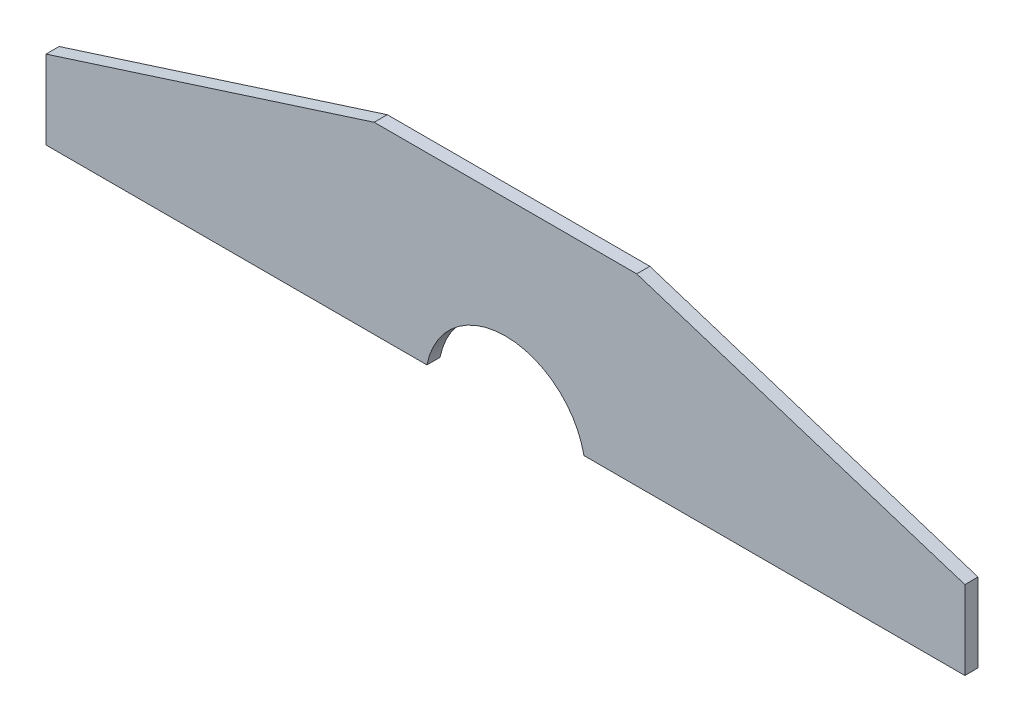
ISO-10303-21;
HEADER;
FILE_DESCRIPTION(('STEP AP214'),'2;1');
FILE_NAME('part.step','',(''),(''),'','','');
FILE_SCHEMA(('AUTOMOTIVE_DESIGN { 1 0 10303 214 1 1 1 1 }'));
ENDSEC;
DATA;
#1=APPLICATION_CONTEXT('core data for automotive mechanical design processes');
#2=APPLICATION_PROTOCOL_DEFINITION('international standard','automotive_design',2000,#1);
#3=PRODUCT_CONTEXT('',#1,'mechanical');
#4=PRODUCT('Part','Part','',(#3));
#5=PRODUCT_RELATED_PRODUCT_CATEGORY('part','',(#4));
#6=PRODUCT_DEFINITION_FORMATION('','',#4);
#7=PRODUCT_DEFINITION_CONTEXT('part definition',#1,'design');
#8=PRODUCT_DEFINITION('design','',#6,#7);
#9=PRODUCT_DEFINITION_SHAPE('','',#8);
#10=(LENGTH_UNIT() NAMED_UNIT(*) SI_UNIT(.MILLI.,.METRE.));
#11=(NAMED_UNIT(*) PLANE_ANGLE_UNIT() SI_UNIT($,.RADIAN.));
#12=(NAMED_UNIT(*) SI_UNIT($,.STERADIAN.) SOLID_ANGLE_UNIT());
#13=UNCERTAINTY_MEASURE_WITH_UNIT(LENGTH_MEASURE(1.E-05),#10,'distance_accuracy_value','');
#14=(GEOMETRIC_REPRESENTATION_CONTEXT(3) GLOBAL_UNCERTAINTY_ASSIGNED_CONTEXT((#13)) GLOBAL_UNIT_ASSIGNED_CONTEXT((#10,
#11,#12)) REPRESENTATION_CONTEXT('',''));
#15=CARTESIAN_POINT('',(0.,0.,0.));
#16=DIRECTION('',(0.,0.,1.));
#17=DIRECTION('',(1.,0.,0.));
#18=AXIS2_PLACEMENT_3D('',#15,#16,#17);
#19=CARTESIAN_POINT('',(-175.,6.,5.));
#20=DIRECTION('',(1.,0.,0.));
#21=DIRECTION('',(0.,0.,-1.));
#22=AXIS2_PLACEMENT_3D('',#19,#20,#21);
#23=PLANE('',#22);
#24=DIRECTION('',(0.,-1.,0.));
#25=VECTOR('',#24,1.);
#26=CARTESIAN_POINT('',(-175.,6.,0.));
#27=LINE('',#26,#25);
#28=CARTESIAN_POINT('',(-175.,36.,0.));
#29=VERTEX_POINT('',#28);
#30=CARTESIAN_POINT('',(-175.,6.,0.));
#31=VERTEX_POINT('',#30);
#32=EDGE_CURVE('E142',#29,#31,#27,.T.);
#33=ORIENTED_EDGE('',*,*,#32,.T.);
#34=DIRECTION('',(0.,0.,-1.));
#35=VECTOR('',#34,1.);
#36=CARTESIAN_POINT('',(-175.,6.,5.));
#37=LINE('',#36,#35);
#38=CARTESIAN_POINT('',(-175.,6.,5.));
#39=VERTEX_POINT('',#38);
#40=EDGE_CURVE('E13',#39,#31,#37,.T.);
#41=ORIENTED_EDGE('',*,*,#40,.F.);
#42=DIRECTION('',(0.,-1.,0.));
#43=VECTOR('',#42,1.);
#44=CARTESIAN_POINT('',(-175.,6.,5.));
#45=LINE('',#44,#43);
#46=CARTESIAN_POINT('',(-175.,36.,5.));
#47=VERTEX_POINT('',#46);
#48=EDGE_CURVE('E156',#47,#39,#45,.T.);
#49=ORIENTED_EDGE('',*,*,#48,.F.);
#50=DIRECTION('',(0.,0.,-1.));
#51=VECTOR('',#50,1.);
#52=CARTESIAN_POINT('',(-175.,36.,5.));
#53=LINE('',#52,#51);
#54=EDGE_CURVE('E138',#47,#29,#53,.T.);
#55=ORIENTED_EDGE('',*,*,#54,.T.);
#56=EDGE_LOOP('',(#33,#41,#49,#55));
#57=FACE_BOUND('',#56,.T.);
#58=ADVANCED_FACE('F46',(#57),#23,.F.);
#59=CARTESIAN_POINT('',(-175.,6.,5.));
#60=DIRECTION('',(0.,1.,0.));
#61=DIRECTION('',(0.,0.,1.));
#62=AXIS2_PLACEMENT_3D('',#59,#60,#61);
#63=PLANE('',#62);
#64=DIRECTION('',(1.,0.,0.));
#65=VECTOR('',#64,1.);
#66=CARTESIAN_POINT('',(-175.,6.,0.));
#67=LINE('',#66,#65);
#68=CARTESIAN_POINT('',(-29.9040131086114,6.,0.));
#69=VERTEX_POINT('',#68);
#70=EDGE_CURVE('E145',#31,#69,#67,.T.);
#71=ORIENTED_EDGE('',*,*,#70,.T.);
#72=DIRECTION('',(0.,0.,-1.));
#73=VECTOR('',#72,1.);
#74=CARTESIAN_POINT('',(-29.9040131086114,6.,5.));
#75=LINE('',#74,#73);
#76=CARTESIAN_POINT('',(-29.9040131086114,6.,5.));
#77=VERTEX_POINT('',#76);
#78=EDGE_CURVE('E54',#77,#69,#75,.T.);
#79=ORIENTED_EDGE('',*,*,#78,.F.);
#80=DIRECTION('',(1.,0.,0.));
#81=VECTOR('',#80,1.);
#82=CARTESIAN_POINT('',(-175.,6.,5.));
#83=LINE('',#82,#81);
#84=EDGE_CURVE('E105',#39,#77,#83,.T.);
#85=ORIENTED_EDGE('',*,*,#84,.F.);
#86=ORIENTED_EDGE('',*,*,#40,.T.);
#87=EDGE_LOOP('',(#71,#79,#85,#86));
#88=FACE_BOUND('',#87,.T.);
#89=ADVANCED_FACE('F191',(#88),#63,.F.);
#90=CARTESIAN_POINT('',(0.,0.,5.));
#91=DIRECTION('',(0.,0.,-1.));
#92=DIRECTION('',(-1.,0.,0.));
#93=AXIS2_PLACEMENT_3D('',#90,#91,#92);
#94=CYLINDRICAL_SURFACE('',#93,30.5);
#95=CARTESIAN_POINT('',(0.,0.,0.));
#96=DIRECTION('',(0.,0.,-1.));
#97=DIRECTION('',(1.,0.,0.));
#98=AXIS2_PLACEMENT_3D('',#95,#96,#97);
#99=CIRCLE('',#98,30.5);
#100=CARTESIAN_POINT('',(29.9040131086114,6.,0.));
#101=VERTEX_POINT('',#100);
#102=EDGE_CURVE('E147',#69,#101,#99,.T.);
#103=ORIENTED_EDGE('',*,*,#102,.T.);
#104=DIRECTION('',(0.,0.,-1.));
#105=VECTOR('',#104,1.);
#106=CARTESIAN_POINT('',(29.9040131086114,6.,5.));
#107=LINE('',#106,#105);
#108=CARTESIAN_POINT('',(29.9040131086114,6.,5.));
#109=VERTEX_POINT('',#108);
#110=EDGE_CURVE('E163',#109,#101,#107,.T.);
#111=ORIENTED_EDGE('',*,*,#110,.F.);
#112=CARTESIAN_POINT('',(0.,0.,5.));
#113=DIRECTION('',(0.,0.,-1.));
#114=DIRECTION('',(1.,0.,0.));
#115=AXIS2_PLACEMENT_3D('',#112,#113,#114);
#116=CIRCLE('',#115,30.5);
#117=EDGE_CURVE('E171',#77,#109,#116,.T.);
#118=ORIENTED_EDGE('',*,*,#117,.F.);
#119=ORIENTED_EDGE('',*,*,#78,.T.);
#120=EDGE_LOOP('',(#103,#111,#118,#119));
#121=FACE_BOUND('',#120,.T.);
#122=ADVANCED_FACE('F169',(#121),#94,.F.);
#123=CARTESIAN_POINT('',(29.9040131086114,6.,5.));
#124=DIRECTION('',(0.,1.,0.));
#125=DIRECTION('',(0.,0.,1.));
#126=AXIS2_PLACEMENT_3D('',#123,#124,#125);
#127=PLANE('',#126);
#128=DIRECTION('',(1.,0.,0.));
#129=VECTOR('',#128,1.);
#130=CARTESIAN_POINT('',(29.9040131086114,6.,0.));
#131=LINE('',#130,#129);
#132=CARTESIAN_POINT('',(175.,6.,0.));
#133=VERTEX_POINT('',#132);
#134=EDGE_CURVE('E149',#101,#133,#131,.T.);
#135=ORIENTED_EDGE('',*,*,#134,.T.);
#136=DIRECTION('',(0.,0.,-1.));
#137=VECTOR('',#136,1.);
#138=CARTESIAN_POINT('',(175.,6.,5.));
#139=LINE('',#138,#137);
#140=CARTESIAN_POINT('',(175.,6.,5.));
#141=VERTEX_POINT('',#140);
#142=EDGE_CURVE('E160',#141,#133,#139,.T.);
#143=ORIENTED_EDGE('',*,*,#142,.F.);
#144=DIRECTION('',(1.,0.,0.));
#145=VECTOR('',#144,1.);
#146=CARTESIAN_POINT('',(29.9040131086114,6.,5.));
#147=LINE('',#146,#145);
#148=EDGE_CURVE('E183',#109,#141,#147,.T.);
#149=ORIENTED_EDGE('',*,*,#148,.F.);
#150=ORIENTED_EDGE('',*,*,#110,.T.);
#151=EDGE_LOOP('',(#135,#143,#149,#150));
#152=FACE_BOUND('',#151,.T.);
#153=ADVANCED_FACE('F179',(#152),#127,.F.);
#154=CARTESIAN_POINT('',(175.,6.,5.));
#155=DIRECTION('',(-1.,0.,0.));
#156=DIRECTION('',(0.,0.,1.));
#157=AXIS2_PLACEMENT_3D('',#154,#155,#156);
#158=PLANE('',#157);
#159=DIRECTION('',(0.,1.,0.));
#160=VECTOR('',#159,1.);
#161=CARTESIAN_POINT('',(175.,6.,0.));
#162=LINE('',#161,#160);
#163=CARTESIAN_POINT('',(175.,36.,0.));
#164=VERTEX_POINT('',#163);
#165=EDGE_CURVE('E151',#133,#164,#162,.T.);
#166=ORIENTED_EDGE('',*,*,#165,.T.);
#167=DIRECTION('',(0.,0.,-1.));
#168=VECTOR('',#167,1.);
#169=CARTESIAN_POINT('',(175.,36.,5.));
#170=LINE('',#169,#168);
#171=CARTESIAN_POINT('',(175.,36.,5.));
#172=VERTEX_POINT('',#171);
#173=EDGE_CURVE('E133',#172,#164,#170,.T.);
#174=ORIENTED_EDGE('',*,*,#173,.F.);
#175=DIRECTION('',(0.,1.,0.));
#176=VECTOR('',#175,1.);
#177=CARTESIAN_POINT('',(175.,6.,5.));
#178=LINE('',#177,#176);
#179=EDGE_CURVE('E124',#141,#172,#178,.T.);
#180=ORIENTED_EDGE('',*,*,#179,.F.);
#181=ORIENTED_EDGE('',*,*,#142,.T.);
#182=EDGE_LOOP('',(#166,#174,#180,#181));
#183=FACE_BOUND('',#182,.T.);
#184=ADVANCED_FACE('F182',(#183),#158,.F.);
#185=CARTESIAN_POINT('',(50.,76.,5.));
#186=DIRECTION('',(-0.304775727103784,-0.952424147199324,0.));
#187=DIRECTION('',(0.952424147199324,-0.304775727103784,0.));
#188=AXIS2_PLACEMENT_3D('',#185,#186,#187);
#189=PLANE('',#188);
#190=DIRECTION('',(-0.952424147199324,0.304775727103784,0.));
#191=VECTOR('',#190,1.);
#192=CARTESIAN_POINT('',(50.,76.,0.));
#193=LINE('',#192,#191);
#194=CARTESIAN_POINT('',(50.,76.,0.));
#195=VERTEX_POINT('',#194);
#196=EDGE_CURVE('E132',#164,#195,#193,.T.);
#197=ORIENTED_EDGE('',*,*,#196,.T.);
#198=DIRECTION('',(0.,0.,-1.));
#199=VECTOR('',#198,1.);
#200=CARTESIAN_POINT('',(50.,76.,5.));
#201=LINE('',#200,#199);
#202=CARTESIAN_POINT('',(50.,76.,5.));
#203=VERTEX_POINT('',#202);
#204=EDGE_CURVE('E129',#203,#195,#201,.T.);
#205=ORIENTED_EDGE('',*,*,#204,.F.);
#206=DIRECTION('',(-0.952424147199324,0.304775727103784,0.));
#207=VECTOR('',#206,1.);
#208=CARTESIAN_POINT('',(50.,76.,5.));
#209=LINE('',#208,#207);
#210=EDGE_CURVE('E118',#172,#203,#209,.T.);
#211=ORIENTED_EDGE('',*,*,#210,.F.);
#212=ORIENTED_EDGE('',*,*,#173,.T.);
#213=EDGE_LOOP('',(#197,#205,#211,#212));
#214=FACE_BOUND('',#213,.T.);
#215=ADVANCED_FACE('F130',(#214),#189,.F.);
#216=CARTESIAN_POINT('',(-50.,76.,5.));
#217=DIRECTION('',(0.,-1.,0.));
#218=DIRECTION('',(0.,0.,-1.));
#219=AXIS2_PLACEMENT_3D('',#216,#217,#218);
#220=PLANE('',#219);
#221=DIRECTION('',(-1.,0.,0.));
#222=VECTOR('',#221,1.);
#223=CARTESIAN_POINT('',(-50.,76.,0.));
#224=LINE('',#223,#222);
#225=CARTESIAN_POINT('',(-50.,76.,0.));
#226=VERTEX_POINT('',#225);
#227=EDGE_CURVE('E91',#195,#226,#224,.T.);
#228=ORIENTED_EDGE('',*,*,#227,.T.);
#229=DIRECTION('',(0.,0.,-1.));
#230=VECTOR('',#229,1.);
#231=CARTESIAN_POINT('',(-50.,76.,5.));
#232=LINE('',#231,#230);
#233=CARTESIAN_POINT('',(-50.,76.,5.));
#234=VERTEX_POINT('',#233);
#235=EDGE_CURVE('E134',#234,#226,#232,.T.);
#236=ORIENTED_EDGE('',*,*,#235,.F.);
#237=DIRECTION('',(-1.,0.,0.));
#238=VECTOR('',#237,1.);
#239=CARTESIAN_POINT('',(-50.,76.,5.));
#240=LINE('',#239,#238);
#241=EDGE_CURVE('E122',#203,#234,#240,.T.);
#242=ORIENTED_EDGE('',*,*,#241,.F.);
#243=ORIENTED_EDGE('',*,*,#204,.T.);
#244=EDGE_LOOP('',(#228,#236,#242,#243));
#245=FACE_BOUND('',#244,.T.);
#246=ADVANCED_FACE('F136',(#245),#220,.F.);
#247=CARTESIAN_POINT('',(-175.,36.,5.));
#248=DIRECTION('',(0.304775727103784,-0.952424147199324,0.));
#249=DIRECTION('',(0.952424147199324,0.304775727103784,0.));
#250=AXIS2_PLACEMENT_3D('',#247,#248,#249);
#251=PLANE('',#250);
#252=DIRECTION('',(-0.952424147199324,-0.304775727103784,0.));
#253=VECTOR('',#252,1.);
#254=CARTESIAN_POINT('',(-175.,36.,0.));
#255=LINE('',#254,#253);
#256=EDGE_CURVE('E97',#226,#29,#255,.T.);
#257=ORIENTED_EDGE('',*,*,#256,.T.);
#258=ORIENTED_EDGE('',*,*,#54,.F.);
#259=DIRECTION('',(-0.952424147199324,-0.304775727103784,0.));
#260=VECTOR('',#259,1.);
#261=CARTESIAN_POINT('',(-175.,36.,5.));
#262=LINE('',#261,#260);
#263=EDGE_CURVE('E62',#234,#47,#262,.T.);
#264=ORIENTED_EDGE('',*,*,#263,.F.);
#265=ORIENTED_EDGE('',*,*,#235,.T.);
#266=EDGE_LOOP('',(#257,#258,#264,#265));
#267=FACE_BOUND('',#266,.T.);
#268=ADVANCED_FACE('F207',(#267),#251,.F.);
#269=CARTESIAN_POINT('',(0.,0.,5.));
#270=DIRECTION('',(0.,0.,1.));
#271=DIRECTION('',(1.,0.,0.));
#272=AXIS2_PLACEMENT_3D('',#269,#270,#271);
#273=PLANE('',#272);
#274=ORIENTED_EDGE('',*,*,#48,.T.);
#275=ORIENTED_EDGE('',*,*,#84,.T.);
#276=ORIENTED_EDGE('',*,*,#117,.T.);
#277=ORIENTED_EDGE('',*,*,#148,.T.);
#278=ORIENTED_EDGE('',*,*,#179,.T.);
#279=ORIENTED_EDGE('',*,*,#210,.T.);
#280=ORIENTED_EDGE('',*,*,#241,.T.);
#281=ORIENTED_EDGE('',*,*,#263,.T.);
#282=EDGE_LOOP('',(#274,#275,#276,#277,#278,#279,#280,#281));
#283=FACE_BOUND('',#282,.T.);
#284=ADVANCED_FACE('F120',(#283),#273,.T.);
#285=CARTESIAN_POINT('',(0.,0.,0.));
#286=DIRECTION('',(0.,0.,1.));
#287=DIRECTION('',(1.,0.,0.));
#288=AXIS2_PLACEMENT_3D('',#285,#286,#287);
#289=PLANE('',#288);
#290=ORIENTED_EDGE('',*,*,#32,.F.);
#291=ORIENTED_EDGE('',*,*,#256,.F.);
#292=ORIENTED_EDGE('',*,*,#227,.F.);
#293=ORIENTED_EDGE('',*,*,#196,.F.);
#294=ORIENTED_EDGE('',*,*,#165,.F.);
#295=ORIENTED_EDGE('',*,*,#134,.F.);
#296=ORIENTED_EDGE('',*,*,#102,.F.);
#297=ORIENTED_EDGE('',*,*,#70,.F.);
#298=EDGE_LOOP('',(#290,#291,#292,#293,#294,#295,#296,#297));
#299=FACE_BOUND('',#298,.T.);
#300=ADVANCED_FACE('F175',(#299),#289,.F.);
#301=CLOSED_SHELL('',(#58,#89,#122,#153,#184,#215,#246,#268,#284,#300));
#302=MANIFOLD_SOLID_BREP('B2',#301);
#303=ADVANCED_BREP_SHAPE_REPRESENTATION('',(#18,#302),#14);
#304=SHAPE_DEFINITION_REPRESENTATION(#9,#303);
ENDSEC;
END-ISO-10303-21;
